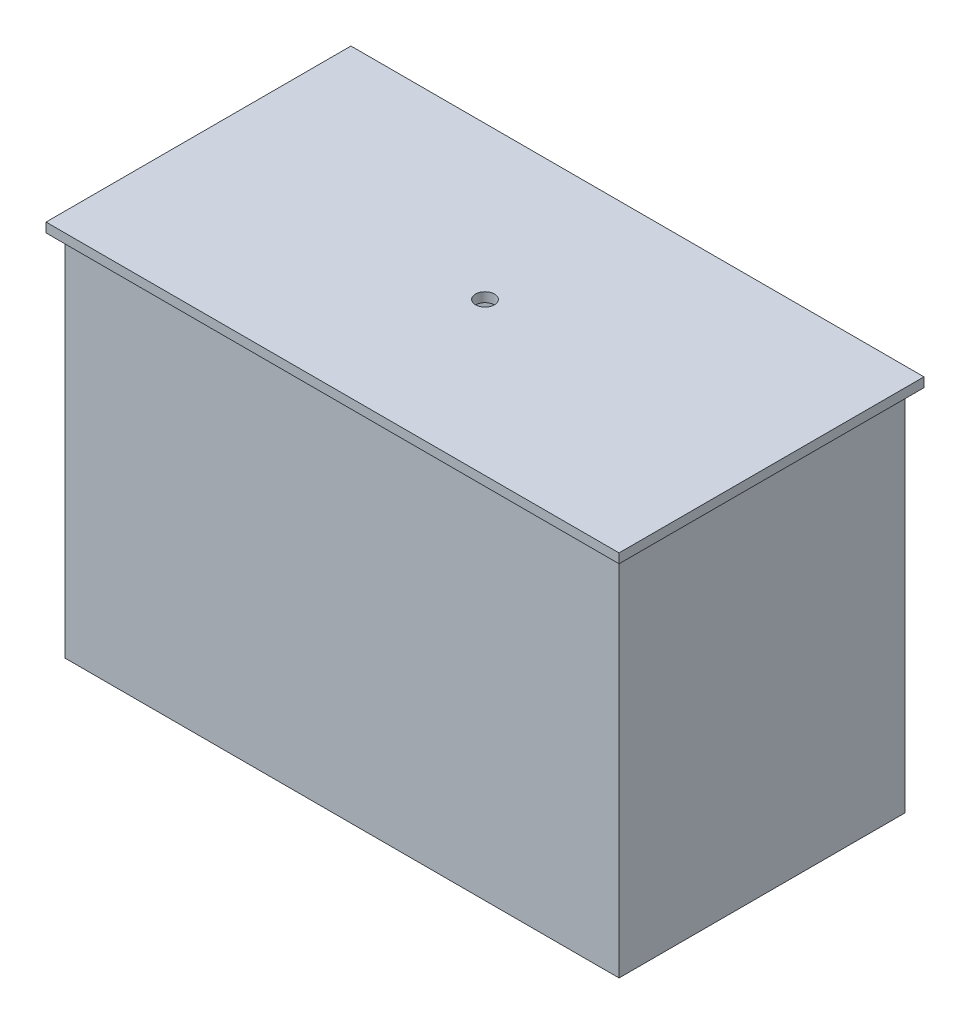
ISO-10303-21;
HEADER;
FILE_DESCRIPTION(('STEP AP214'),'2;1');
FILE_NAME('part.step','',(''),(''),'','','');
FILE_SCHEMA(('AUTOMOTIVE_DESIGN { 1 0 10303 214 1 1 1 1 }'));
ENDSEC;
DATA;
#1=APPLICATION_CONTEXT('core data for automotive mechanical design processes');
#2=APPLICATION_PROTOCOL_DEFINITION('international standard','automotive_design',2000,#1);
#3=PRODUCT_CONTEXT('',#1,'mechanical');
#4=PRODUCT('Part','Part','',(#3));
#5=PRODUCT_RELATED_PRODUCT_CATEGORY('part','',(#4));
#6=PRODUCT_DEFINITION_FORMATION('','',#4);
#7=PRODUCT_DEFINITION_CONTEXT('part definition',#1,'design');
#8=PRODUCT_DEFINITION('design','',#6,#7);
#9=PRODUCT_DEFINITION_SHAPE('','',#8);
#10=(LENGTH_UNIT() NAMED_UNIT(*) SI_UNIT(.MILLI.,.METRE.));
#11=(NAMED_UNIT(*) PLANE_ANGLE_UNIT() SI_UNIT($,.RADIAN.));
#12=(NAMED_UNIT(*) SI_UNIT($,.STERADIAN.) SOLID_ANGLE_UNIT());
#13=UNCERTAINTY_MEASURE_WITH_UNIT(LENGTH_MEASURE(1.E-05),#10,'distance_accuracy_value','');
#14=(GEOMETRIC_REPRESENTATION_CONTEXT(3) GLOBAL_UNCERTAINTY_ASSIGNED_CONTEXT((#13)) GLOBAL_UNIT_ASSIGNED_CONTEXT((#10,
#11,#12)) REPRESENTATION_CONTEXT('',''));
#15=CARTESIAN_POINT('',(0.,0.,0.));
#16=DIRECTION('',(0.,0.,1.));
#17=DIRECTION('',(1.,0.,0.));
#18=AXIS2_PLACEMENT_3D('',#15,#16,#17);
#19=CARTESIAN_POINT('',(0.,10.,0.));
#20=DIRECTION('',(0.,1.,0.));
#21=DIRECTION('',(0.,0.,1.));
#22=AXIS2_PLACEMENT_3D('',#19,#20,#21);
#23=PLANE('',#22);
#24=CARTESIAN_POINT('',(-248.5,10.,0.));
#25=DIRECTION('',(0.,1.,0.));
#26=DIRECTION('',(0.,0.,1.));
#27=AXIS2_PLACEMENT_3D('',#24,#25,#26);
#28=CIRCLE('',#27,9.99999999999998);
#29=CARTESIAN_POINT('',(-248.5,10.,9.99999999999998));
#30=VERTEX_POINT('',#29);
#31=EDGE_CURVE('E438',#30,#30,#28,.F.);
#32=ORIENTED_EDGE('',*,*,#31,.T.);
#33=EDGE_LOOP('',(#32));
#34=FACE_BOUND('',#33,.T.);
#35=DIRECTION('',(1.,0.,0.));
#36=VECTOR('',#35,1.);
#37=CARTESIAN_POINT('',(-283.5,10.,141.5));
#38=LINE('',#37,#36);
#39=CARTESIAN_POINT('',(-283.5,10.,141.5));
#40=VERTEX_POINT('',#39);
#41=CARTESIAN_POINT('',(283.5,10.,141.5));
#42=VERTEX_POINT('',#41);
#43=EDGE_CURVE('E50',#40,#42,#38,.T.);
#44=ORIENTED_EDGE('',*,*,#43,.T.);
#45=DIRECTION('',(0.,0.,-1.));
#46=VECTOR('',#45,1.);
#47=CARTESIAN_POINT('',(283.5,10.,141.5));
#48=LINE('',#47,#46);
#49=CARTESIAN_POINT('',(283.5,10.,-141.5));
#50=VERTEX_POINT('',#49);
#51=EDGE_CURVE('E54',#42,#50,#48,.T.);
#52=ORIENTED_EDGE('',*,*,#51,.T.);
#53=DIRECTION('',(-1.,0.,0.));
#54=VECTOR('',#53,1.);
#55=CARTESIAN_POINT('',(283.5,10.,-141.5));
#56=LINE('',#55,#54);
#57=CARTESIAN_POINT('',(-283.5,10.,-141.5));
#58=VERTEX_POINT('',#57);
#59=EDGE_CURVE('E185',#50,#58,#56,.T.);
#60=ORIENTED_EDGE('',*,*,#59,.T.);
#61=DIRECTION('',(0.,0.,1.));
#62=VECTOR('',#61,1.);
#63=CARTESIAN_POINT('',(-283.5,10.,-141.5));
#64=LINE('',#63,#62);
#65=EDGE_CURVE('E173',#58,#40,#64,.T.);
#66=ORIENTED_EDGE('',*,*,#65,.T.);
#67=EDGE_LOOP('',(#44,#52,#60,#66));
#68=FACE_BOUND('',#67,.T.);
#69=ADVANCED_FACE('F35',(#34,#68),#23,.T.);
#70=CARTESIAN_POINT('',(283.5,390.,-141.5));
#71=DIRECTION('',(0.,0.,1.));
#72=DIRECTION('',(1.,0.,0.));
#73=AXIS2_PLACEMENT_3D('',#70,#71,#72);
#74=PLANE('',#73);
#75=ORIENTED_EDGE('',*,*,#59,.F.);
#76=DIRECTION('',(0.,-1.,0.));
#77=VECTOR('',#76,1.);
#78=CARTESIAN_POINT('',(283.5,390.,-141.5));
#79=LINE('',#78,#77);
#80=CARTESIAN_POINT('',(283.5,390.,-141.5));
#81=VERTEX_POINT('',#80);
#82=EDGE_CURVE('E193',#81,#50,#79,.T.);
#83=ORIENTED_EDGE('',*,*,#82,.F.);
#84=DIRECTION('',(-1.,0.,0.));
#85=VECTOR('',#84,1.);
#86=CARTESIAN_POINT('',(283.5,390.,-141.5));
#87=LINE('',#86,#85);
#88=CARTESIAN_POINT('',(-283.5,390.,-141.5));
#89=VERTEX_POINT('',#88);
#90=EDGE_CURVE('E176',#81,#89,#87,.T.);
#91=ORIENTED_EDGE('',*,*,#90,.T.);
#92=DIRECTION('',(0.,-1.,0.));
#93=VECTOR('',#92,1.);
#94=CARTESIAN_POINT('',(-283.5,390.,-141.5));
#95=LINE('',#94,#93);
#96=EDGE_CURVE('E190',#89,#58,#95,.T.);
#97=ORIENTED_EDGE('',*,*,#96,.T.);
#98=EDGE_LOOP('',(#75,#83,#91,#97));
#99=FACE_BOUND('',#98,.T.);
#100=ADVANCED_FACE('F249',(#99),#74,.T.);
#101=CARTESIAN_POINT('',(-283.5,390.,-141.5));
#102=DIRECTION('',(1.,0.,0.));
#103=DIRECTION('',(0.,0.,-1.));
#104=AXIS2_PLACEMENT_3D('',#101,#102,#103);
#105=PLANE('',#104);
#106=ORIENTED_EDGE('',*,*,#65,.F.);
#107=ORIENTED_EDGE('',*,*,#96,.F.);
#108=DIRECTION('',(0.,0.,1.));
#109=VECTOR('',#108,1.);
#110=CARTESIAN_POINT('',(-283.5,390.,-141.5));
#111=LINE('',#110,#109);
#112=CARTESIAN_POINT('',(-283.5,390.,141.5));
#113=VERTEX_POINT('',#112);
#114=EDGE_CURVE('E179',#89,#113,#111,.T.);
#115=ORIENTED_EDGE('',*,*,#114,.T.);
#116=DIRECTION('',(0.,-1.,0.));
#117=VECTOR('',#116,1.);
#118=CARTESIAN_POINT('',(-283.5,390.,141.5));
#119=LINE('',#118,#117);
#120=EDGE_CURVE('E182',#113,#40,#119,.T.);
#121=ORIENTED_EDGE('',*,*,#120,.T.);
#122=EDGE_LOOP('',(#106,#107,#115,#121));
#123=FACE_BOUND('',#122,.T.);
#124=ADVANCED_FACE('F255',(#123),#105,.T.);
#125=CARTESIAN_POINT('',(-283.5,390.,141.5));
#126=DIRECTION('',(0.,0.,-1.));
#127=DIRECTION('',(-1.,0.,0.));
#128=AXIS2_PLACEMENT_3D('',#125,#126,#127);
#129=PLANE('',#128);
#130=ORIENTED_EDGE('',*,*,#43,.F.);
#131=ORIENTED_EDGE('',*,*,#120,.F.);
#132=DIRECTION('',(1.,0.,0.));
#133=VECTOR('',#132,1.);
#134=CARTESIAN_POINT('',(-283.5,390.,141.5));
#135=LINE('',#134,#133);
#136=CARTESIAN_POINT('',(283.5,390.,141.5));
#137=VERTEX_POINT('',#136);
#138=EDGE_CURVE('E169',#113,#137,#135,.T.);
#139=ORIENTED_EDGE('',*,*,#138,.T.);
#140=DIRECTION('',(0.,-1.,0.));
#141=VECTOR('',#140,1.);
#142=CARTESIAN_POINT('',(283.5,390.,141.5));
#143=LINE('',#142,#141);
#144=EDGE_CURVE('E195',#137,#42,#143,.T.);
#145=ORIENTED_EDGE('',*,*,#144,.T.);
#146=EDGE_LOOP('',(#130,#131,#139,#145));
#147=FACE_BOUND('',#146,.T.);
#148=ADVANCED_FACE('F261',(#147),#129,.T.);
#149=CARTESIAN_POINT('',(283.5,390.,141.5));
#150=DIRECTION('',(-1.,0.,0.));
#151=DIRECTION('',(0.,0.,1.));
#152=AXIS2_PLACEMENT_3D('',#149,#150,#151);
#153=PLANE('',#152);
#154=ORIENTED_EDGE('',*,*,#51,.F.);
#155=ORIENTED_EDGE('',*,*,#144,.F.);
#156=DIRECTION('',(0.,0.,-1.));
#157=VECTOR('',#156,1.);
#158=CARTESIAN_POINT('',(283.5,390.,141.5));
#159=LINE('',#158,#157);
#160=EDGE_CURVE('E172',#137,#81,#159,.T.);
#161=ORIENTED_EDGE('',*,*,#160,.T.);
#162=ORIENTED_EDGE('',*,*,#82,.T.);
#163=EDGE_LOOP('',(#154,#155,#161,#162));
#164=FACE_BOUND('',#163,.T.);
#165=ADVANCED_FACE('F344',(#164),#153,.T.);
#166=CARTESIAN_POINT('',(-303.5,390.,-161.5));
#167=DIRECTION('',(0.,1.,0.));
#168=DIRECTION('',(0.,0.,1.));
#169=AXIS2_PLACEMENT_3D('',#166,#167,#168);
#170=PLANE('',#169);
#171=CARTESIAN_POINT('',(0.,390.,0.));
#172=DIRECTION('',(0.,1.,0.));
#173=DIRECTION('',(0.,0.,1.));
#174=AXIS2_PLACEMENT_3D('',#171,#172,#173);
#175=CIRCLE('',#174,10.);
#176=CARTESIAN_POINT('',(0.,390.,10.));
#177=VERTEX_POINT('',#176);
#178=EDGE_CURVE('E148',#177,#177,#175,.F.);
#179=ORIENTED_EDGE('',*,*,#178,.F.);
#180=EDGE_LOOP('',(#179));
#181=FACE_BOUND('',#180,.T.);
#182=ORIENTED_EDGE('',*,*,#160,.F.);
#183=ORIENTED_EDGE('',*,*,#138,.F.);
#184=ORIENTED_EDGE('',*,*,#114,.F.);
#185=ORIENTED_EDGE('',*,*,#90,.F.);
#186=EDGE_LOOP('',(#182,#183,#184,#185));
#187=FACE_BOUND('',#186,.T.);
#188=ADVANCED_FACE('F283',(#181,#187),#170,.F.);
#189=CARTESIAN_POINT('',(0.,-0.000999999999973245,0.));
#190=DIRECTION('',(0.,1.,0.));
#191=DIRECTION('',(0.,0.,1.));
#192=AXIS2_PLACEMENT_3D('',#189,#190,#191);
#193=CYLINDRICAL_SURFACE('',#192,10.);
#194=CARTESIAN_POINT('',(0.,400.,0.));
#195=DIRECTION('',(0.,1.,0.));
#196=DIRECTION('',(0.,0.,1.));
#197=AXIS2_PLACEMENT_3D('',#194,#195,#196);
#198=CIRCLE('',#197,10.);
#199=CARTESIAN_POINT('',(0.,400.,10.));
#200=VERTEX_POINT('',#199);
#201=EDGE_CURVE('E151',#200,#200,#198,.T.);
#202=ORIENTED_EDGE('',*,*,#201,.T.);
#203=EDGE_LOOP('',(#202));
#204=FACE_BOUND('',#203,.T.);
#205=ORIENTED_EDGE('',*,*,#178,.T.);
#206=EDGE_LOOP('',(#205));
#207=FACE_BOUND('',#206,.T.);
#208=ADVANCED_FACE('F247',(#204,#207),#193,.F.);
#209=CARTESIAN_POINT('',(293.5,10.,-151.5));
#210=DIRECTION('',(-1.,0.,0.));
#211=DIRECTION('',(0.,0.,1.));
#212=AXIS2_PLACEMENT_3D('',#209,#210,#211);
#213=PLANE('',#212);
#214=DIRECTION('',(0.,0.,-1.));
#215=VECTOR('',#214,1.);
#216=CARTESIAN_POINT('',(293.5,0.,-151.5));
#217=LINE('',#216,#215);
#218=CARTESIAN_POINT('',(293.5,0.,151.5));
#219=VERTEX_POINT('',#218);
#220=CARTESIAN_POINT('',(293.5,0.,-151.5));
#221=VERTEX_POINT('',#220);
#222=EDGE_CURVE('E210',#219,#221,#217,.T.);
#223=ORIENTED_EDGE('',*,*,#222,.T.);
#224=DIRECTION('',(0.,-1.,0.));
#225=VECTOR('',#224,1.);
#226=CARTESIAN_POINT('',(293.5,10.,-151.5));
#227=LINE('',#226,#225);
#228=CARTESIAN_POINT('',(293.5,390.,-151.5));
#229=VERTEX_POINT('',#228);
#230=EDGE_CURVE('E11',#229,#221,#227,.T.);
#231=ORIENTED_EDGE('',*,*,#230,.F.);
#232=DIRECTION('',(0.,0.,-1.));
#233=VECTOR('',#232,1.);
#234=CARTESIAN_POINT('',(293.5,390.,151.5));
#235=LINE('',#234,#233);
#236=CARTESIAN_POINT('',(293.5,390.,151.5));
#237=VERTEX_POINT('',#236);
#238=EDGE_CURVE('E204',#237,#229,#235,.T.);
#239=ORIENTED_EDGE('',*,*,#238,.F.);
#240=DIRECTION('',(0.,-1.,0.));
#241=VECTOR('',#240,1.);
#242=CARTESIAN_POINT('',(293.5,10.,151.5));
#243=LINE('',#242,#241);
#244=EDGE_CURVE('E219',#237,#219,#243,.T.);
#245=ORIENTED_EDGE('',*,*,#244,.T.);
#246=EDGE_LOOP('',(#223,#231,#239,#245));
#247=FACE_BOUND('',#246,.T.);
#248=ADVANCED_FACE('F37',(#247),#213,.F.);
#249=CARTESIAN_POINT('',(-293.5,10.,-151.5));
#250=DIRECTION('',(0.,0.,1.));
#251=DIRECTION('',(1.,0.,0.));
#252=AXIS2_PLACEMENT_3D('',#249,#250,#251);
#253=PLANE('',#252);
#254=DIRECTION('',(-1.,0.,0.));
#255=VECTOR('',#254,1.);
#256=CARTESIAN_POINT('',(-293.5,0.,-151.5));
#257=LINE('',#256,#255);
#258=CARTESIAN_POINT('',(-293.5,0.,-151.5));
#259=VERTEX_POINT('',#258);
#260=EDGE_CURVE('E213',#221,#259,#257,.T.);
#261=ORIENTED_EDGE('',*,*,#260,.T.);
#262=DIRECTION('',(0.,-1.,0.));
#263=VECTOR('',#262,1.);
#264=CARTESIAN_POINT('',(-293.5,10.,-151.5));
#265=LINE('',#264,#263);
#266=CARTESIAN_POINT('',(-293.5,390.,-151.5));
#267=VERTEX_POINT('',#266);
#268=EDGE_CURVE('E43',#267,#259,#265,.T.);
#269=ORIENTED_EDGE('',*,*,#268,.F.);
#270=DIRECTION('',(-1.,0.,0.));
#271=VECTOR('',#270,1.);
#272=CARTESIAN_POINT('',(293.5,390.,-151.5));
#273=LINE('',#272,#271);
#274=EDGE_CURVE('E207',#229,#267,#273,.T.);
#275=ORIENTED_EDGE('',*,*,#274,.F.);
#276=ORIENTED_EDGE('',*,*,#230,.T.);
#277=EDGE_LOOP('',(#261,#269,#275,#276));
#278=FACE_BOUND('',#277,.T.);
#279=ADVANCED_FACE('F240',(#278),#253,.F.);
#280=CARTESIAN_POINT('',(-293.5,10.,-151.5));
#281=DIRECTION('',(1.,0.,0.));
#282=DIRECTION('',(0.,0.,-1.));
#283=AXIS2_PLACEMENT_3D('',#280,#281,#282);
#284=PLANE('',#283);
#285=DIRECTION('',(0.,0.,1.));
#286=VECTOR('',#285,1.);
#287=CARTESIAN_POINT('',(-293.5,0.,-151.5));
#288=LINE('',#287,#286);
#289=CARTESIAN_POINT('',(-293.5,0.,151.5));
#290=VERTEX_POINT('',#289);
#291=EDGE_CURVE('E215',#259,#290,#288,.T.);
#292=ORIENTED_EDGE('',*,*,#291,.T.);
#293=DIRECTION('',(0.,-1.,0.));
#294=VECTOR('',#293,1.);
#295=CARTESIAN_POINT('',(-293.5,10.,151.5));
#296=LINE('',#295,#294);
#297=CARTESIAN_POINT('',(-293.5,390.,151.5));
#298=VERTEX_POINT('',#297);
#299=EDGE_CURVE('E222',#298,#290,#296,.T.);
#300=ORIENTED_EDGE('',*,*,#299,.F.);
#301=DIRECTION('',(0.,0.,1.));
#302=VECTOR('',#301,1.);
#303=CARTESIAN_POINT('',(-293.5,390.,-151.5));
#304=LINE('',#303,#302);
#305=EDGE_CURVE('E198',#267,#298,#304,.T.);
#306=ORIENTED_EDGE('',*,*,#305,.F.);
#307=ORIENTED_EDGE('',*,*,#268,.T.);
#308=EDGE_LOOP('',(#292,#300,#306,#307));
#309=FACE_BOUND('',#308,.T.);
#310=ADVANCED_FACE('F228',(#309),#284,.F.);
#311=CARTESIAN_POINT('',(-293.5,10.,151.5));
#312=DIRECTION('',(0.,0.,-1.));
#313=DIRECTION('',(-1.,0.,0.));
#314=AXIS2_PLACEMENT_3D('',#311,#312,#313);
#315=PLANE('',#314);
#316=DIRECTION('',(1.,0.,0.));
#317=VECTOR('',#316,1.);
#318=CARTESIAN_POINT('',(-293.5,0.,151.5));
#319=LINE('',#318,#317);
#320=EDGE_CURVE('E217',#290,#219,#319,.T.);
#321=ORIENTED_EDGE('',*,*,#320,.T.);
#322=ORIENTED_EDGE('',*,*,#244,.F.);
#323=DIRECTION('',(1.,0.,0.));
#324=VECTOR('',#323,1.);
#325=CARTESIAN_POINT('',(-293.5,390.,151.5));
#326=LINE('',#325,#324);
#327=EDGE_CURVE('E201',#298,#237,#326,.T.);
#328=ORIENTED_EDGE('',*,*,#327,.F.);
#329=ORIENTED_EDGE('',*,*,#299,.T.);
#330=EDGE_LOOP('',(#321,#322,#328,#329));
#331=FACE_BOUND('',#330,.T.);
#332=ADVANCED_FACE('F236',(#331),#315,.F.);
#333=CARTESIAN_POINT('',(0.,0.,0.));
#334=DIRECTION('',(0.,1.,0.));
#335=DIRECTION('',(0.,0.,1.));
#336=AXIS2_PLACEMENT_3D('',#333,#334,#335);
#337=PLANE('',#336);
#338=CARTESIAN_POINT('',(-248.5,0.,0.));
#339=DIRECTION('',(0.,-1.,0.));
#340=DIRECTION('',(0.,0.,-1.));
#341=AXIS2_PLACEMENT_3D('',#338,#339,#340);
#342=CIRCLE('',#341,9.99999999999998);
#343=CARTESIAN_POINT('',(-248.5,0.,-9.99999999999998));
#344=VERTEX_POINT('',#343);
#345=EDGE_CURVE('E436',#344,#344,#342,.T.);
#346=ORIENTED_EDGE('',*,*,#345,.F.);
#347=EDGE_LOOP('',(#346));
#348=FACE_BOUND('',#347,.T.);
#349=ORIENTED_EDGE('',*,*,#222,.F.);
#350=ORIENTED_EDGE('',*,*,#320,.F.);
#351=ORIENTED_EDGE('',*,*,#291,.F.);
#352=ORIENTED_EDGE('',*,*,#260,.F.);
#353=EDGE_LOOP('',(#349,#350,#351,#352));
#354=FACE_BOUND('',#353,.T.);
#355=ADVANCED_FACE('F234',(#348,#354),#337,.F.);
#356=DIRECTION('',(1.,0.,0.));
#357=VECTOR('',#356,1.);
#358=CARTESIAN_POINT('',(-303.5,390.,-161.5));
#359=LINE('',#358,#357);
#360=CARTESIAN_POINT('',(-303.5,390.,-161.5));
#361=VERTEX_POINT('',#360);
#362=CARTESIAN_POINT('',(303.5,390.,-161.5));
#363=VERTEX_POINT('',#362);
#364=EDGE_CURVE('E122',#361,#363,#359,.T.);
#365=ORIENTED_EDGE('',*,*,#364,.T.);
#366=DIRECTION('',(0.,0.,1.));
#367=VECTOR('',#366,1.);
#368=CARTESIAN_POINT('',(303.5,390.,-161.5));
#369=LINE('',#368,#367);
#370=CARTESIAN_POINT('',(303.5,390.,161.5));
#371=VERTEX_POINT('',#370);
#372=EDGE_CURVE('E127',#363,#371,#369,.T.);
#373=ORIENTED_EDGE('',*,*,#372,.T.);
#374=DIRECTION('',(1.,0.,0.));
#375=VECTOR('',#374,1.);
#376=CARTESIAN_POINT('',(-303.5,390.,161.5));
#377=LINE('',#376,#375);
#378=CARTESIAN_POINT('',(-303.5,390.,161.5));
#379=VERTEX_POINT('',#378);
#380=EDGE_CURVE('E133',#379,#371,#377,.T.);
#381=ORIENTED_EDGE('',*,*,#380,.F.);
#382=DIRECTION('',(0.,0.,1.));
#383=VECTOR('',#382,1.);
#384=CARTESIAN_POINT('',(-303.5,390.,-161.5));
#385=LINE('',#384,#383);
#386=EDGE_CURVE('E128',#361,#379,#385,.T.);
#387=ORIENTED_EDGE('',*,*,#386,.F.);
#388=EDGE_LOOP('',(#365,#373,#381,#387));
#389=FACE_BOUND('',#388,.T.);
#390=ORIENTED_EDGE('',*,*,#274,.T.);
#391=ORIENTED_EDGE('',*,*,#305,.T.);
#392=ORIENTED_EDGE('',*,*,#327,.T.);
#393=ORIENTED_EDGE('',*,*,#238,.T.);
#394=EDGE_LOOP('',(#390,#391,#392,#393));
#395=FACE_BOUND('',#394,.T.);
#396=ADVANCED_FACE('F124',(#389,#395),#170,.F.);
#397=CARTESIAN_POINT('',(-303.5,390.,-161.5));
#398=DIRECTION('',(0.,0.,1.));
#399=DIRECTION('',(1.,0.,0.));
#400=AXIS2_PLACEMENT_3D('',#397,#398,#399);
#401=PLANE('',#400);
#402=DIRECTION('',(1.,0.,0.));
#403=VECTOR('',#402,1.);
#404=CARTESIAN_POINT('',(-303.5,400.,-161.5));
#405=LINE('',#404,#403);
#406=CARTESIAN_POINT('',(-303.5,400.,-161.5));
#407=VERTEX_POINT('',#406);
#408=CARTESIAN_POINT('',(303.5,400.,-161.5));
#409=VERTEX_POINT('',#408);
#410=EDGE_CURVE('E147',#407,#409,#405,.T.);
#411=ORIENTED_EDGE('',*,*,#410,.T.);
#412=DIRECTION('',(0.,-1.,0.));
#413=VECTOR('',#412,1.);
#414=CARTESIAN_POINT('',(303.5,390.,-161.5));
#415=LINE('',#414,#413);
#416=EDGE_CURVE('E140',#409,#363,#415,.T.);
#417=ORIENTED_EDGE('',*,*,#416,.T.);
#418=ORIENTED_EDGE('',*,*,#364,.F.);
#419=DIRECTION('',(0.,-1.,0.));
#420=VECTOR('',#419,1.);
#421=CARTESIAN_POINT('',(-303.5,390.,-161.5));
#422=LINE('',#421,#420);
#423=EDGE_CURVE('E158',#407,#361,#422,.T.);
#424=ORIENTED_EDGE('',*,*,#423,.F.);
#425=EDGE_LOOP('',(#411,#417,#418,#424));
#426=FACE_BOUND('',#425,.T.);
#427=ADVANCED_FACE('F145',(#426),#401,.F.);
#428=CARTESIAN_POINT('',(-303.5,390.,161.5));
#429=DIRECTION('',(0.,0.,-1.));
#430=DIRECTION('',(-1.,0.,0.));
#431=AXIS2_PLACEMENT_3D('',#428,#429,#430);
#432=PLANE('',#431);
#433=ORIENTED_EDGE('',*,*,#380,.T.);
#434=DIRECTION('',(0.,1.,0.));
#435=VECTOR('',#434,1.);
#436=CARTESIAN_POINT('',(303.5,390.,161.5));
#437=LINE('',#436,#435);
#438=CARTESIAN_POINT('',(303.5,400.,161.5));
#439=VERTEX_POINT('',#438);
#440=EDGE_CURVE('E143',#371,#439,#437,.T.);
#441=ORIENTED_EDGE('',*,*,#440,.T.);
#442=DIRECTION('',(1.,0.,0.));
#443=VECTOR('',#442,1.);
#444=CARTESIAN_POINT('',(-303.5,400.,161.5));
#445=LINE('',#444,#443);
#446=CARTESIAN_POINT('',(-303.5,400.,161.5));
#447=VERTEX_POINT('',#446);
#448=EDGE_CURVE('E166',#447,#439,#445,.T.);
#449=ORIENTED_EDGE('',*,*,#448,.F.);
#450=DIRECTION('',(0.,1.,0.));
#451=VECTOR('',#450,1.);
#452=CARTESIAN_POINT('',(-303.5,390.,161.5));
#453=LINE('',#452,#451);
#454=EDGE_CURVE('E161',#379,#447,#453,.T.);
#455=ORIENTED_EDGE('',*,*,#454,.F.);
#456=EDGE_LOOP('',(#433,#441,#449,#455));
#457=FACE_BOUND('',#456,.T.);
#458=ADVANCED_FACE('F289',(#457),#432,.F.);
#459=CARTESIAN_POINT('',(-303.5,400.,-161.5));
#460=DIRECTION('',(0.,-1.,0.));
#461=DIRECTION('',(0.,0.,-1.));
#462=AXIS2_PLACEMENT_3D('',#459,#460,#461);
#463=PLANE('',#462);
#464=ORIENTED_EDGE('',*,*,#201,.F.);
#465=EDGE_LOOP('',(#464));
#466=FACE_BOUND('',#465,.T.);
#467=ORIENTED_EDGE('',*,*,#448,.T.);
#468=DIRECTION('',(0.,0.,-1.));
#469=VECTOR('',#468,1.);
#470=CARTESIAN_POINT('',(303.5,400.,-161.5));
#471=LINE('',#470,#469);
#472=EDGE_CURVE('E156',#439,#409,#471,.T.);
#473=ORIENTED_EDGE('',*,*,#472,.T.);
#474=ORIENTED_EDGE('',*,*,#410,.F.);
#475=DIRECTION('',(0.,0.,-1.));
#476=VECTOR('',#475,1.);
#477=CARTESIAN_POINT('',(-303.5,400.,-161.5));
#478=LINE('',#477,#476);
#479=EDGE_CURVE('E163',#447,#407,#478,.T.);
#480=ORIENTED_EDGE('',*,*,#479,.F.);
#481=EDGE_LOOP('',(#467,#473,#474,#480));
#482=FACE_BOUND('',#481,.T.);
#483=ADVANCED_FACE('F296',(#466,#482),#463,.F.);
#484=CARTESIAN_POINT('',(-303.5,0.,0.));
#485=DIRECTION('',(1.,0.,0.));
#486=DIRECTION('',(0.,0.,-1.));
#487=AXIS2_PLACEMENT_3D('',#484,#485,#486);
#488=PLANE('',#487);
#489=ORIENTED_EDGE('',*,*,#423,.T.);
#490=ORIENTED_EDGE('',*,*,#386,.T.);
#491=ORIENTED_EDGE('',*,*,#454,.T.);
#492=ORIENTED_EDGE('',*,*,#479,.T.);
#493=EDGE_LOOP('',(#489,#490,#491,#492));
#494=FACE_BOUND('',#493,.T.);
#495=ADVANCED_FACE('F305',(#494),#488,.F.);
#496=CARTESIAN_POINT('',(303.5,0.,0.));
#497=DIRECTION('',(1.,0.,0.));
#498=DIRECTION('',(0.,0.,-1.));
#499=AXIS2_PLACEMENT_3D('',#496,#497,#498);
#500=PLANE('',#499);
#501=ORIENTED_EDGE('',*,*,#416,.F.);
#502=ORIENTED_EDGE('',*,*,#472,.F.);
#503=ORIENTED_EDGE('',*,*,#440,.F.);
#504=ORIENTED_EDGE('',*,*,#372,.F.);
#505=EDGE_LOOP('',(#501,#502,#503,#504));
#506=FACE_BOUND('',#505,.T.);
#507=ADVANCED_FACE('F138',(#506),#500,.T.);
#508=CARTESIAN_POINT('',(-248.5,400.001,0.));
#509=DIRECTION('',(0.,-1.,0.));
#510=DIRECTION('',(0.,0.,-1.));
#511=AXIS2_PLACEMENT_3D('',#508,#509,#510);
#512=CYLINDRICAL_SURFACE('',#511,9.99999999999998);
#513=ORIENTED_EDGE('',*,*,#31,.F.);
#514=EDGE_LOOP('',(#513));
#515=FACE_BOUND('',#514,.T.);
#516=ORIENTED_EDGE('',*,*,#345,.T.);
#517=EDGE_LOOP('',(#516));
#518=FACE_BOUND('',#517,.T.);
#519=ADVANCED_FACE('F320',(#515,#518),#512,.F.);
#520=CLOSED_SHELL('',(#69,#100,#124,#148,#165,#188,#208,#248,#279,#310,#332,#355,#396,#427,#458,
#483,#495,#507,#519));
#521=MANIFOLD_SOLID_BREP('B2',#520);
#522=ADVANCED_BREP_SHAPE_REPRESENTATION('',(#18,#521),#14);
#523=SHAPE_DEFINITION_REPRESENTATION(#9,#522);
ENDSEC;
END-ISO-10303-21;
